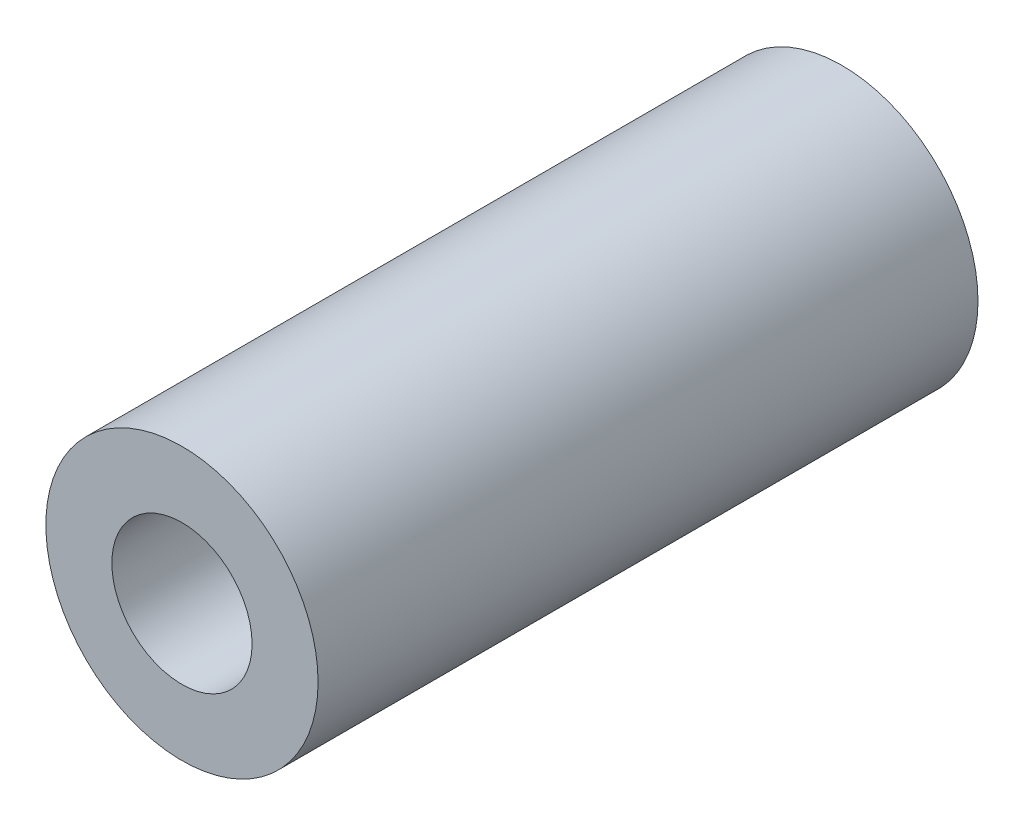
ISO-10303-21;
HEADER;
FILE_DESCRIPTION(('STEP AP214'),'2;1');
FILE_NAME('part.step','',(''),(''),'','','');
FILE_SCHEMA(('AUTOMOTIVE_DESIGN { 1 0 10303 214 1 1 1 1 }'));
ENDSEC;
DATA;
#1=APPLICATION_CONTEXT('core data for automotive mechanical design processes');
#2=APPLICATION_PROTOCOL_DEFINITION('international standard','automotive_design',2000,#1);
#3=PRODUCT_CONTEXT('',#1,'mechanical');
#4=PRODUCT('Part','Part','',(#3));
#5=PRODUCT_RELATED_PRODUCT_CATEGORY('part','',(#4));
#6=PRODUCT_DEFINITION_FORMATION('','',#4);
#7=PRODUCT_DEFINITION_CONTEXT('part definition',#1,'design');
#8=PRODUCT_DEFINITION('design','',#6,#7);
#9=PRODUCT_DEFINITION_SHAPE('','',#8);
#10=(LENGTH_UNIT() NAMED_UNIT(*) SI_UNIT(.MILLI.,.METRE.));
#11=(NAMED_UNIT(*) PLANE_ANGLE_UNIT() SI_UNIT($,.RADIAN.));
#12=(NAMED_UNIT(*) SI_UNIT($,.STERADIAN.) SOLID_ANGLE_UNIT());
#13=UNCERTAINTY_MEASURE_WITH_UNIT(LENGTH_MEASURE(1.E-05),#10,'distance_accuracy_value','');
#14=(GEOMETRIC_REPRESENTATION_CONTEXT(3) GLOBAL_UNCERTAINTY_ASSIGNED_CONTEXT((#13)) GLOBAL_UNIT_ASSIGNED_CONTEXT((#10,
#11,#12)) REPRESENTATION_CONTEXT('',''));
#15=CARTESIAN_POINT('',(0.,0.,0.));
#16=DIRECTION('',(0.,0.,1.));
#17=DIRECTION('',(1.,0.,0.));
#18=AXIS2_PLACEMENT_3D('',#15,#16,#17);
#19=CARTESIAN_POINT('',(0.,0.,16.));
#20=DIRECTION('',(0.,0.,1.));
#21=DIRECTION('',(1.,0.,0.));
#22=AXIS2_PLACEMENT_3D('',#19,#20,#21);
#23=PLANE('',#22);
#24=CARTESIAN_POINT('',(0.,0.,16.));
#25=DIRECTION('',(0.,0.,1.));
#26=DIRECTION('',(1.,0.,0.));
#27=AXIS2_PLACEMENT_3D('',#24,#25,#26);
#28=CIRCLE('',#27,3.3);
#29=CARTESIAN_POINT('',(3.3,0.,16.));
#30=VERTEX_POINT('',#29);
#31=EDGE_CURVE('E10',#30,#30,#28,.T.);
#32=ORIENTED_EDGE('',*,*,#31,.T.);
#33=EDGE_LOOP('',(#32));
#34=FACE_BOUND('',#33,.T.);
#35=CARTESIAN_POINT('',(0.,0.,16.));
#36=DIRECTION('',(0.,0.,1.));
#37=DIRECTION('',(1.,0.,0.));
#38=AXIS2_PLACEMENT_3D('',#35,#36,#37);
#39=CIRCLE('',#38,1.7);
#40=CARTESIAN_POINT('',(1.7,0.,16.));
#41=VERTEX_POINT('',#40);
#42=EDGE_CURVE('E46',#41,#41,#39,.T.);
#43=ORIENTED_EDGE('',*,*,#42,.F.);
#44=EDGE_LOOP('',(#43));
#45=FACE_BOUND('',#44,.T.);
#46=ADVANCED_FACE('F35',(#34,#45),#23,.T.);
#47=CARTESIAN_POINT('',(0.,0.,0.));
#48=DIRECTION('',(0.,0.,1.));
#49=DIRECTION('',(1.,0.,0.));
#50=AXIS2_PLACEMENT_3D('',#47,#48,#49);
#51=PLANE('',#50);
#52=CARTESIAN_POINT('',(0.,0.,0.));
#53=DIRECTION('',(0.,0.,1.));
#54=DIRECTION('',(1.,0.,0.));
#55=AXIS2_PLACEMENT_3D('',#52,#53,#54);
#56=CIRCLE('',#55,3.3);
#57=CARTESIAN_POINT('',(3.3,0.,0.));
#58=VERTEX_POINT('',#57);
#59=EDGE_CURVE('E39',#58,#58,#56,.T.);
#60=ORIENTED_EDGE('',*,*,#59,.F.);
#61=EDGE_LOOP('',(#60));
#62=FACE_BOUND('',#61,.T.);
#63=CARTESIAN_POINT('',(0.,0.,0.));
#64=DIRECTION('',(0.,0.,1.));
#65=DIRECTION('',(1.,0.,0.));
#66=AXIS2_PLACEMENT_3D('',#63,#64,#65);
#67=CIRCLE('',#66,1.7);
#68=CARTESIAN_POINT('',(1.7,0.,0.));
#69=VERTEX_POINT('',#68);
#70=EDGE_CURVE('E48',#69,#69,#67,.T.);
#71=ORIENTED_EDGE('',*,*,#70,.T.);
#72=EDGE_LOOP('',(#71));
#73=FACE_BOUND('',#72,.T.);
#74=ADVANCED_FACE('F58',(#62,#73),#51,.F.);
#75=CARTESIAN_POINT('',(0.,0.,16.));
#76=DIRECTION('',(0.,0.,-1.));
#77=DIRECTION('',(-1.,0.,0.));
#78=AXIS2_PLACEMENT_3D('',#75,#76,#77);
#79=CYLINDRICAL_SURFACE('',#78,3.3);
#80=ORIENTED_EDGE('',*,*,#31,.F.);
#81=EDGE_LOOP('',(#80));
#82=FACE_BOUND('',#81,.T.);
#83=ORIENTED_EDGE('',*,*,#59,.T.);
#84=EDGE_LOOP('',(#83));
#85=FACE_BOUND('',#84,.T.);
#86=ADVANCED_FACE('F37',(#82,#85),#79,.T.);
#87=CARTESIAN_POINT('',(0.,0.,16.));
#88=DIRECTION('',(0.,0.,-1.));
#89=DIRECTION('',(-1.,0.,0.));
#90=AXIS2_PLACEMENT_3D('',#87,#88,#89);
#91=CYLINDRICAL_SURFACE('',#90,1.7);
#92=ORIENTED_EDGE('',*,*,#42,.T.);
#93=EDGE_LOOP('',(#92));
#94=FACE_BOUND('',#93,.T.);
#95=ORIENTED_EDGE('',*,*,#70,.F.);
#96=EDGE_LOOP('',(#95));
#97=FACE_BOUND('',#96,.T.);
#98=ADVANCED_FACE('F54',(#94,#97),#91,.F.);
#99=CLOSED_SHELL('',(#46,#74,#86,#98));
#100=MANIFOLD_SOLID_BREP('B2',#99);
#101=ADVANCED_BREP_SHAPE_REPRESENTATION('',(#18,#100),#14);
#102=SHAPE_DEFINITION_REPRESENTATION(#9,#101);
ENDSEC;
END-ISO-10303-21;
